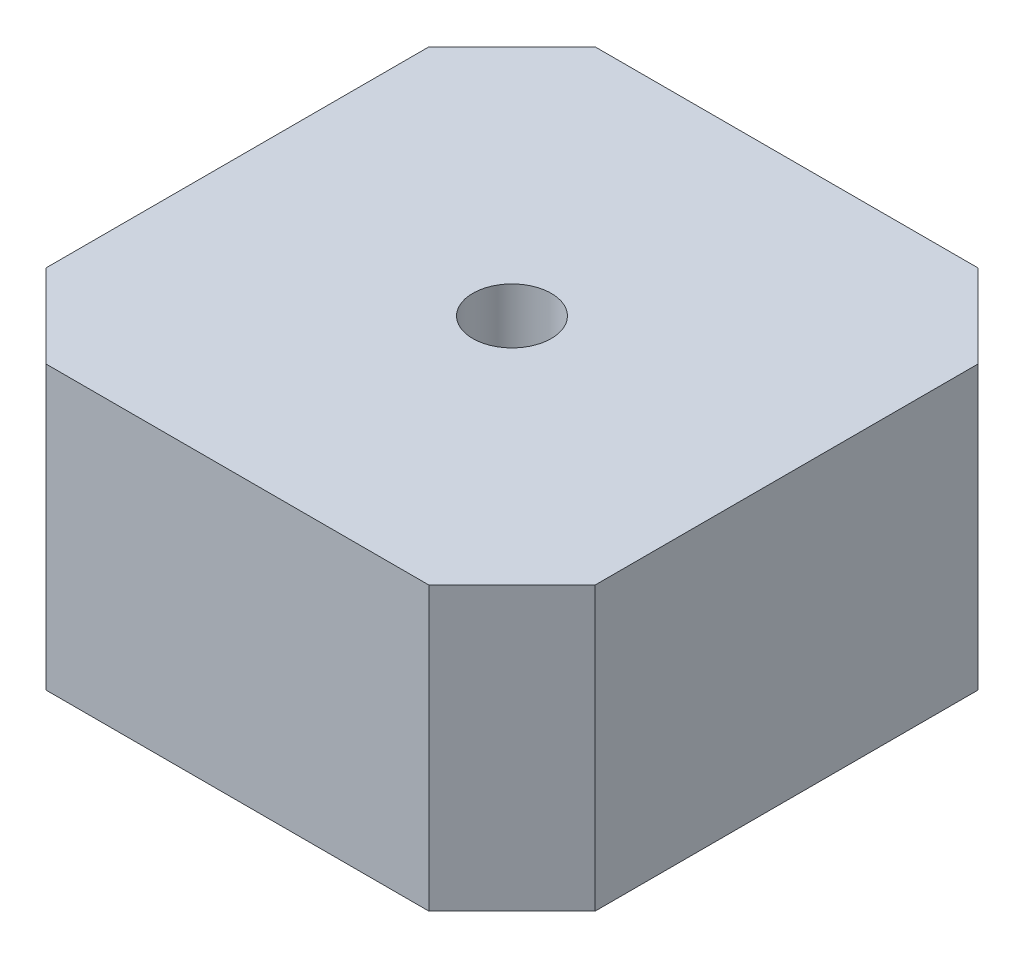
ISO-10303-21;
HEADER;
FILE_DESCRIPTION(('STEP AP214'),'2;1');
FILE_NAME('part.step','',(''),(''),'','','');
FILE_SCHEMA(('AUTOMOTIVE_DESIGN { 1 0 10303 214 1 1 1 1 }'));
ENDSEC;
DATA;
#1=APPLICATION_CONTEXT('core data for automotive mechanical design processes');
#2=APPLICATION_PROTOCOL_DEFINITION('international standard','automotive_design',2000,#1);
#3=PRODUCT_CONTEXT('',#1,'mechanical');
#4=PRODUCT('Part','Part','',(#3));
#5=PRODUCT_RELATED_PRODUCT_CATEGORY('part','',(#4));
#6=PRODUCT_DEFINITION_FORMATION('','',#4);
#7=PRODUCT_DEFINITION_CONTEXT('part definition',#1,'design');
#8=PRODUCT_DEFINITION('design','',#6,#7);
#9=PRODUCT_DEFINITION_SHAPE('','',#8);
#10=(LENGTH_UNIT() NAMED_UNIT(*) SI_UNIT(.MILLI.,.METRE.));
#11=(NAMED_UNIT(*) PLANE_ANGLE_UNIT() SI_UNIT($,.RADIAN.));
#12=(NAMED_UNIT(*) SI_UNIT($,.STERADIAN.) SOLID_ANGLE_UNIT());
#13=UNCERTAINTY_MEASURE_WITH_UNIT(LENGTH_MEASURE(1.E-05),#10,'distance_accuracy_value','');
#14=(GEOMETRIC_REPRESENTATION_CONTEXT(3) GLOBAL_UNCERTAINTY_ASSIGNED_CONTEXT((#13)) GLOBAL_UNIT_ASSIGNED_CONTEXT((#10,
#11,#12)) REPRESENTATION_CONTEXT('',''));
#15=CARTESIAN_POINT('',(0.,0.,0.));
#16=DIRECTION('',(0.,0.,1.));
#17=DIRECTION('',(1.,0.,0.));
#18=AXIS2_PLACEMENT_3D('',#15,#16,#17);
#19=CARTESIAN_POINT('',(0.,18.,0.));
#20=DIRECTION('',(1.,0.,0.));
#21=DIRECTION('',(0.,0.,-1.));
#22=AXIS2_PLACEMENT_3D('',#19,#20,#21);
#23=PLANE('',#22);
#24=DIRECTION('',(0.,1.,0.));
#25=VECTOR('',#24,1.);
#26=CARTESIAN_POINT('',(0.,0.,-5.30151519016501));
#27=LINE('',#26,#25);
#28=CARTESIAN_POINT('',(0.,0.,-5.30151519016501));
#29=VERTEX_POINT('',#28);
#30=CARTESIAN_POINT('',(0.,18.,-5.30151519016501));
#31=VERTEX_POINT('',#30);
#32=EDGE_CURVE('E105',#29,#31,#27,.T.);
#33=ORIENTED_EDGE('',*,*,#32,.T.);
#34=DIRECTION('',(0.,0.,1.));
#35=VECTOR('',#34,1.);
#36=CARTESIAN_POINT('',(0.,18.,0.));
#37=LINE('',#36,#35);
#38=CARTESIAN_POINT('',(0.,18.,-29.698484809835));
#39=VERTEX_POINT('',#38);
#40=EDGE_CURVE('E134',#39,#31,#37,.T.);
#41=ORIENTED_EDGE('',*,*,#40,.F.);
#42=DIRECTION('',(0.,1.,0.));
#43=VECTOR('',#42,1.);
#44=CARTESIAN_POINT('',(0.,0.,-29.698484809835));
#45=LINE('',#44,#43);
#46=CARTESIAN_POINT('',(0.,0.,-29.698484809835));
#47=VERTEX_POINT('',#46);
#48=EDGE_CURVE('E140',#47,#39,#45,.T.);
#49=ORIENTED_EDGE('',*,*,#48,.F.);
#50=DIRECTION('',(0.,0.,1.));
#51=VECTOR('',#50,1.);
#52=CARTESIAN_POINT('',(0.,0.,0.));
#53=LINE('',#52,#51);
#54=EDGE_CURVE('E125',#47,#29,#53,.T.);
#55=ORIENTED_EDGE('',*,*,#54,.T.);
#56=EDGE_LOOP('',(#33,#41,#49,#55));
#57=FACE_BOUND('',#56,.T.);
#58=ADVANCED_FACE('F34',(#57),#23,.F.);
#59=CARTESIAN_POINT('',(0.,18.,0.));
#60=DIRECTION('',(0.,0.,-1.));
#61=DIRECTION('',(-1.,0.,0.));
#62=AXIS2_PLACEMENT_3D('',#59,#60,#61);
#63=PLANE('',#62);
#64=DIRECTION('',(0.,1.,0.));
#65=VECTOR('',#64,1.);
#66=CARTESIAN_POINT('',(29.698484809835,0.,0.));
#67=LINE('',#66,#65);
#68=CARTESIAN_POINT('',(29.698484809835,0.,0.));
#69=VERTEX_POINT('',#68);
#70=CARTESIAN_POINT('',(29.698484809835,18.,0.));
#71=VERTEX_POINT('',#70);
#72=EDGE_CURVE('E50',#69,#71,#67,.T.);
#73=ORIENTED_EDGE('',*,*,#72,.T.);
#74=DIRECTION('',(1.,0.,0.));
#75=VECTOR('',#74,1.);
#76=CARTESIAN_POINT('',(0.,18.,0.));
#77=LINE('',#76,#75);
#78=CARTESIAN_POINT('',(5.30151519016499,18.,0.));
#79=VERTEX_POINT('',#78);
#80=EDGE_CURVE('E119',#79,#71,#77,.T.);
#81=ORIENTED_EDGE('',*,*,#80,.F.);
#82=DIRECTION('',(0.,1.,0.));
#83=VECTOR('',#82,1.);
#84=CARTESIAN_POINT('',(5.30151519016499,0.,0.));
#85=LINE('',#84,#83);
#86=CARTESIAN_POINT('',(5.30151519016499,0.,0.));
#87=VERTEX_POINT('',#86);
#88=EDGE_CURVE('E102',#87,#79,#85,.T.);
#89=ORIENTED_EDGE('',*,*,#88,.F.);
#90=DIRECTION('',(1.,0.,0.));
#91=VECTOR('',#90,1.);
#92=CARTESIAN_POINT('',(0.,0.,0.));
#93=LINE('',#92,#91);
#94=EDGE_CURVE('E117',#87,#69,#93,.T.);
#95=ORIENTED_EDGE('',*,*,#94,.T.);
#96=EDGE_LOOP('',(#73,#81,#89,#95));
#97=FACE_BOUND('',#96,.T.);
#98=ADVANCED_FACE('F116',(#97),#63,.F.);
#99=CARTESIAN_POINT('',(35.,18.,0.));
#100=DIRECTION('',(-1.,0.,0.));
#101=DIRECTION('',(0.,0.,1.));
#102=AXIS2_PLACEMENT_3D('',#99,#100,#101);
#103=PLANE('',#102);
#104=DIRECTION('',(0.,1.,0.));
#105=VECTOR('',#104,1.);
#106=CARTESIAN_POINT('',(35.,0.,-29.698484809835));
#107=LINE('',#106,#105);
#108=CARTESIAN_POINT('',(35.,0.,-29.698484809835));
#109=VERTEX_POINT('',#108);
#110=CARTESIAN_POINT('',(35.,18.,-29.698484809835));
#111=VERTEX_POINT('',#110);
#112=EDGE_CURVE('E58',#109,#111,#107,.T.);
#113=ORIENTED_EDGE('',*,*,#112,.T.);
#114=DIRECTION('',(0.,0.,-1.));
#115=VECTOR('',#114,1.);
#116=CARTESIAN_POINT('',(35.,18.,0.));
#117=LINE('',#116,#115);
#118=CARTESIAN_POINT('',(35.,18.,-5.30151519016499));
#119=VERTEX_POINT('',#118);
#120=EDGE_CURVE('E42',#119,#111,#117,.T.);
#121=ORIENTED_EDGE('',*,*,#120,.F.);
#122=DIRECTION('',(0.,1.,0.));
#123=VECTOR('',#122,1.);
#124=CARTESIAN_POINT('',(35.,0.,-5.30151519016499));
#125=LINE('',#124,#123);
#126=CARTESIAN_POINT('',(35.,0.,-5.30151519016499));
#127=VERTEX_POINT('',#126);
#128=EDGE_CURVE('E145',#127,#119,#125,.T.);
#129=ORIENTED_EDGE('',*,*,#128,.F.);
#130=DIRECTION('',(0.,0.,-1.));
#131=VECTOR('',#130,1.);
#132=CARTESIAN_POINT('',(35.,0.,0.));
#133=LINE('',#132,#131);
#134=EDGE_CURVE('E124',#127,#109,#133,.T.);
#135=ORIENTED_EDGE('',*,*,#134,.T.);
#136=EDGE_LOOP('',(#113,#121,#129,#135));
#137=FACE_BOUND('',#136,.T.);
#138=ADVANCED_FACE('F196',(#137),#103,.F.);
#139=CARTESIAN_POINT('',(0.,18.,-35.));
#140=DIRECTION('',(0.,0.,1.));
#141=DIRECTION('',(1.,0.,0.));
#142=AXIS2_PLACEMENT_3D('',#139,#140,#141);
#143=PLANE('',#142);
#144=DIRECTION('',(0.,1.,0.));
#145=VECTOR('',#144,1.);
#146=CARTESIAN_POINT('',(29.698484809835,0.,-35.));
#147=LINE('',#146,#145);
#148=CARTESIAN_POINT('',(29.698484809835,0.,-35.));
#149=VERTEX_POINT('',#148);
#150=CARTESIAN_POINT('',(29.698484809835,18.,-35.));
#151=VERTEX_POINT('',#150);
#152=EDGE_CURVE('E128',#149,#151,#147,.T.);
#153=ORIENTED_EDGE('',*,*,#152,.F.);
#154=DIRECTION('',(-1.,0.,0.));
#155=VECTOR('',#154,1.);
#156=CARTESIAN_POINT('',(0.,0.,-35.));
#157=LINE('',#156,#155);
#158=CARTESIAN_POINT('',(5.30151519016502,0.,-35.));
#159=VERTEX_POINT('',#158);
#160=EDGE_CURVE('E37',#149,#159,#157,.T.);
#161=ORIENTED_EDGE('',*,*,#160,.T.);
#162=DIRECTION('',(0.,1.,0.));
#163=VECTOR('',#162,1.);
#164=CARTESIAN_POINT('',(5.30151519016501,0.,-35.));
#165=LINE('',#164,#163);
#166=CARTESIAN_POINT('',(5.30151519016501,18.,-35.));
#167=VERTEX_POINT('',#166);
#168=EDGE_CURVE('E137',#159,#167,#165,.T.);
#169=ORIENTED_EDGE('',*,*,#168,.T.);
#170=DIRECTION('',(-1.,0.,0.));
#171=VECTOR('',#170,1.);
#172=CARTESIAN_POINT('',(0.,18.,-35.));
#173=LINE('',#172,#171);
#174=EDGE_CURVE('E12',#151,#167,#173,.T.);
#175=ORIENTED_EDGE('',*,*,#174,.F.);
#176=EDGE_LOOP('',(#153,#161,#169,#175));
#177=FACE_BOUND('',#176,.T.);
#178=ADVANCED_FACE('F181',(#177),#143,.F.);
#179=CARTESIAN_POINT('',(0.,18.,0.));
#180=DIRECTION('',(0.,-1.,0.));
#181=DIRECTION('',(0.,0.,-1.));
#182=AXIS2_PLACEMENT_3D('',#179,#180,#181);
#183=PLANE('',#182);
#184=CARTESIAN_POINT('',(17.5,18.,-17.5));
#185=DIRECTION('',(0.,1.,0.));
#186=DIRECTION('',(0.,0.,1.));
#187=AXIS2_PLACEMENT_3D('',#184,#185,#186);
#188=CIRCLE('',#187,2.5);
#189=CARTESIAN_POINT('',(17.5,18.,-15.));
#190=VERTEX_POINT('',#189);
#191=EDGE_CURVE('E164',#190,#190,#188,.T.);
#192=ORIENTED_EDGE('',*,*,#191,.F.);
#193=EDGE_LOOP('',(#192));
#194=FACE_BOUND('',#193,.T.);
#195=DIRECTION('',(-0.707106781186546,0.,-0.707106781186549));
#196=VECTOR('',#195,1.);
#197=CARTESIAN_POINT('',(35.,18.,-29.698484809835));
#198=LINE('',#197,#196);
#199=EDGE_CURVE('E149',#111,#151,#198,.T.);
#200=ORIENTED_EDGE('',*,*,#199,.T.);
#201=ORIENTED_EDGE('',*,*,#174,.T.);
#202=DIRECTION('',(-0.707106781186549,0.,0.707106781186546));
#203=VECTOR('',#202,1.);
#204=CARTESIAN_POINT('',(5.30151519016501,18.,-35.));
#205=LINE('',#204,#203);
#206=EDGE_CURVE('E157',#167,#39,#205,.T.);
#207=ORIENTED_EDGE('',*,*,#206,.T.);
#208=ORIENTED_EDGE('',*,*,#40,.T.);
#209=DIRECTION('',(0.707106781186546,0.,0.707106781186549));
#210=VECTOR('',#209,1.);
#211=CARTESIAN_POINT('',(0.,18.,-5.30151519016501));
#212=LINE('',#211,#210);
#213=EDGE_CURVE('E155',#31,#79,#212,.T.);
#214=ORIENTED_EDGE('',*,*,#213,.T.);
#215=ORIENTED_EDGE('',*,*,#80,.T.);
#216=DIRECTION('',(0.707106781186549,0.,-0.707106781186546));
#217=VECTOR('',#216,1.);
#218=CARTESIAN_POINT('',(29.698484809835,18.,0.));
#219=LINE('',#218,#217);
#220=EDGE_CURVE('E152',#71,#119,#219,.T.);
#221=ORIENTED_EDGE('',*,*,#220,.T.);
#222=ORIENTED_EDGE('',*,*,#120,.T.);
#223=EDGE_LOOP('',(#200,#201,#207,#208,#214,#215,#221,#222));
#224=FACE_BOUND('',#223,.T.);
#225=ADVANCED_FACE('F178',(#194,#224),#183,.F.);
#226=CARTESIAN_POINT('',(0.,0.,0.));
#227=DIRECTION('',(0.,-1.,0.));
#228=DIRECTION('',(0.,0.,-1.));
#229=AXIS2_PLACEMENT_3D('',#226,#227,#228);
#230=PLANE('',#229);
#231=CARTESIAN_POINT('',(17.5,0.,-17.5));
#232=DIRECTION('',(0.,1.,0.));
#233=DIRECTION('',(0.,0.,1.));
#234=AXIS2_PLACEMENT_3D('',#231,#232,#233);
#235=CIRCLE('',#234,2.5);
#236=CARTESIAN_POINT('',(17.5,0.,-15.));
#237=VERTEX_POINT('',#236);
#238=EDGE_CURVE('E160',#237,#237,#235,.T.);
#239=ORIENTED_EDGE('',*,*,#238,.T.);
#240=EDGE_LOOP('',(#239));
#241=FACE_BOUND('',#240,.T.);
#242=ORIENTED_EDGE('',*,*,#160,.F.);
#243=DIRECTION('',(-0.707106781186546,0.,-0.707106781186549));
#244=VECTOR('',#243,1.);
#245=CARTESIAN_POINT('',(35.,0.,-29.698484809835));
#246=LINE('',#245,#244);
#247=EDGE_CURVE('E141',#109,#149,#246,.T.);
#248=ORIENTED_EDGE('',*,*,#247,.F.);
#249=ORIENTED_EDGE('',*,*,#134,.F.);
#250=DIRECTION('',(0.707106781186549,0.,-0.707106781186546));
#251=VECTOR('',#250,1.);
#252=CARTESIAN_POINT('',(29.698484809835,0.,0.));
#253=LINE('',#252,#251);
#254=EDGE_CURVE('E110',#69,#127,#253,.T.);
#255=ORIENTED_EDGE('',*,*,#254,.F.);
#256=ORIENTED_EDGE('',*,*,#94,.F.);
#257=DIRECTION('',(0.707106781186546,0.,0.707106781186549));
#258=VECTOR('',#257,1.);
#259=CARTESIAN_POINT('',(0.,0.,-5.30151519016501));
#260=LINE('',#259,#258);
#261=EDGE_CURVE('E99',#29,#87,#260,.T.);
#262=ORIENTED_EDGE('',*,*,#261,.F.);
#263=ORIENTED_EDGE('',*,*,#54,.F.);
#264=DIRECTION('',(-0.707106781186549,0.,0.707106781186546));
#265=VECTOR('',#264,1.);
#266=CARTESIAN_POINT('',(5.30151519016501,0.,-35.));
#267=LINE('',#266,#265);
#268=EDGE_CURVE('E111',#159,#47,#267,.T.);
#269=ORIENTED_EDGE('',*,*,#268,.F.);
#270=EDGE_LOOP('',(#242,#248,#249,#255,#256,#262,#263,#269));
#271=FACE_BOUND('',#270,.T.);
#272=ADVANCED_FACE('F122',(#241,#271),#230,.T.);
#273=CARTESIAN_POINT('',(5.30151519016501,0.,-35.));
#274=DIRECTION('',(-0.707106781186546,0.,-0.707106781186549));
#275=DIRECTION('',(-0.707106781186549,0.,0.707106781186546));
#276=AXIS2_PLACEMENT_3D('',#273,#274,#275);
#277=PLANE('',#276);
#278=ORIENTED_EDGE('',*,*,#206,.F.);
#279=ORIENTED_EDGE('',*,*,#168,.F.);
#280=ORIENTED_EDGE('',*,*,#268,.T.);
#281=ORIENTED_EDGE('',*,*,#48,.T.);
#282=EDGE_LOOP('',(#278,#279,#280,#281));
#283=FACE_BOUND('',#282,.T.);
#284=ADVANCED_FACE('F190',(#283),#277,.T.);
#285=CARTESIAN_POINT('',(0.,0.,-5.30151519016501));
#286=DIRECTION('',(-0.707106781186549,0.,0.707106781186546));
#287=DIRECTION('',(0.707106781186546,0.,0.707106781186549));
#288=AXIS2_PLACEMENT_3D('',#285,#286,#287);
#289=PLANE('',#288);
#290=ORIENTED_EDGE('',*,*,#213,.F.);
#291=ORIENTED_EDGE('',*,*,#32,.F.);
#292=ORIENTED_EDGE('',*,*,#261,.T.);
#293=ORIENTED_EDGE('',*,*,#88,.T.);
#294=EDGE_LOOP('',(#290,#291,#292,#293));
#295=FACE_BOUND('',#294,.T.);
#296=ADVANCED_FACE('F101',(#295),#289,.T.);
#297=CARTESIAN_POINT('',(29.698484809835,0.,0.));
#298=DIRECTION('',(0.707106781186546,0.,0.707106781186549));
#299=DIRECTION('',(0.707106781186549,0.,-0.707106781186546));
#300=AXIS2_PLACEMENT_3D('',#297,#298,#299);
#301=PLANE('',#300);
#302=ORIENTED_EDGE('',*,*,#220,.F.);
#303=ORIENTED_EDGE('',*,*,#72,.F.);
#304=ORIENTED_EDGE('',*,*,#254,.T.);
#305=ORIENTED_EDGE('',*,*,#128,.T.);
#306=EDGE_LOOP('',(#302,#303,#304,#305));
#307=FACE_BOUND('',#306,.T.);
#308=ADVANCED_FACE('F198',(#307),#301,.T.);
#309=CARTESIAN_POINT('',(35.,0.,-29.698484809835));
#310=DIRECTION('',(0.707106781186549,0.,-0.707106781186546));
#311=DIRECTION('',(-0.707106781186546,0.,-0.707106781186549));
#312=AXIS2_PLACEMENT_3D('',#309,#310,#311);
#313=PLANE('',#312);
#314=ORIENTED_EDGE('',*,*,#199,.F.);
#315=ORIENTED_EDGE('',*,*,#112,.F.);
#316=ORIENTED_EDGE('',*,*,#247,.T.);
#317=ORIENTED_EDGE('',*,*,#152,.T.);
#318=EDGE_LOOP('',(#314,#315,#316,#317));
#319=FACE_BOUND('',#318,.T.);
#320=ADVANCED_FACE('F174',(#319),#313,.T.);
#321=CARTESIAN_POINT('',(17.5,0.,-17.5));
#322=DIRECTION('',(0.,1.,0.));
#323=DIRECTION('',(0.,0.,1.));
#324=AXIS2_PLACEMENT_3D('',#321,#322,#323);
#325=CYLINDRICAL_SURFACE('',#324,2.5);
#326=ORIENTED_EDGE('',*,*,#238,.F.);
#327=EDGE_LOOP('',(#326));
#328=FACE_BOUND('',#327,.T.);
#329=ORIENTED_EDGE('',*,*,#191,.T.);
#330=EDGE_LOOP('',(#329));
#331=FACE_BOUND('',#330,.T.);
#332=ADVANCED_FACE('F171',(#328,#331),#325,.F.);
#333=CLOSED_SHELL('',(#58,#98,#138,#178,#225,#272,#284,#296,#308,#320,#332));
#334=MANIFOLD_SOLID_BREP('B2',#333);
#335=ADVANCED_BREP_SHAPE_REPRESENTATION('',(#18,#334),#14);
#336=SHAPE_DEFINITION_REPRESENTATION(#9,#335);
ENDSEC;
END-ISO-10303-21;
